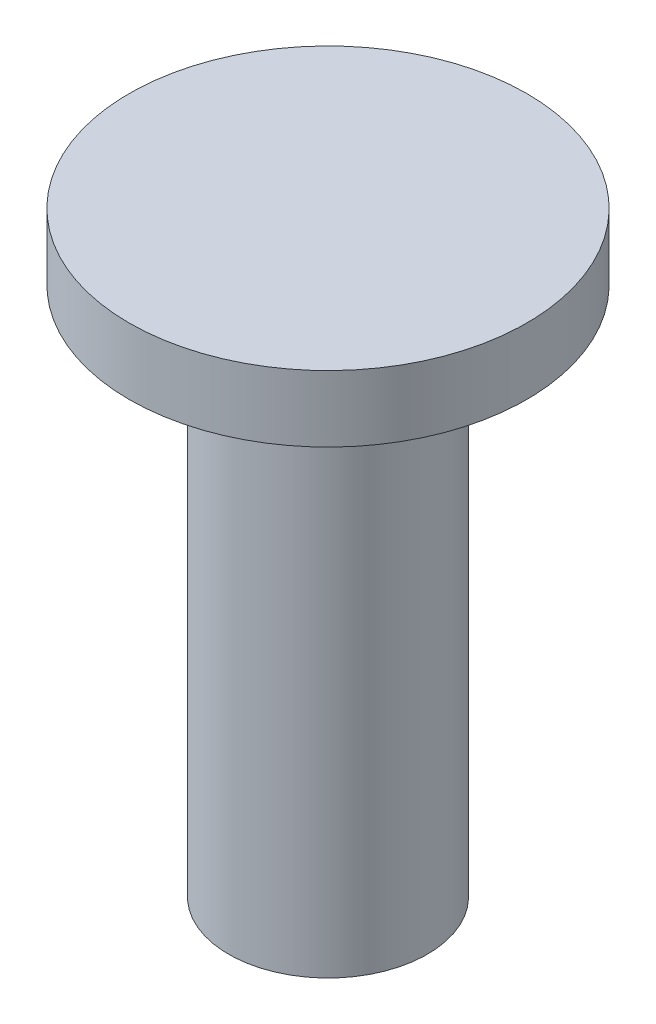
ISO-10303-21;
HEADER;
FILE_DESCRIPTION(('STEP AP214'),'2;1');
FILE_NAME('part.step','',(''),(''),'','','');
FILE_SCHEMA(('AUTOMOTIVE_DESIGN { 1 0 10303 214 1 1 1 1 }'));
ENDSEC;
DATA;
#1=APPLICATION_CONTEXT('core data for automotive mechanical design processes');
#2=APPLICATION_PROTOCOL_DEFINITION('international standard','automotive_design',2000,#1);
#3=PRODUCT_CONTEXT('',#1,'mechanical');
#4=PRODUCT('Part','Part','',(#3));
#5=PRODUCT_RELATED_PRODUCT_CATEGORY('part','',(#4));
#6=PRODUCT_DEFINITION_FORMATION('','',#4);
#7=PRODUCT_DEFINITION_CONTEXT('part definition',#1,'design');
#8=PRODUCT_DEFINITION('design','',#6,#7);
#9=PRODUCT_DEFINITION_SHAPE('','',#8);
#10=(LENGTH_UNIT() NAMED_UNIT(*) SI_UNIT(.MILLI.,.METRE.));
#11=(NAMED_UNIT(*) PLANE_ANGLE_UNIT() SI_UNIT($,.RADIAN.));
#12=(NAMED_UNIT(*) SI_UNIT($,.STERADIAN.) SOLID_ANGLE_UNIT());
#13=UNCERTAINTY_MEASURE_WITH_UNIT(LENGTH_MEASURE(1.E-05),#10,'distance_accuracy_value','');
#14=(GEOMETRIC_REPRESENTATION_CONTEXT(3) GLOBAL_UNCERTAINTY_ASSIGNED_CONTEXT((#13)) GLOBAL_UNIT_ASSIGNED_CONTEXT((#10,
#11,#12)) REPRESENTATION_CONTEXT('',''));
#15=CARTESIAN_POINT('',(0.,0.,0.));
#16=DIRECTION('',(0.,0.,1.));
#17=DIRECTION('',(1.,0.,0.));
#18=AXIS2_PLACEMENT_3D('',#15,#16,#17);
#19=CARTESIAN_POINT('',(0.,1.,0.));
#20=DIRECTION('',(0.,-1.,0.));
#21=DIRECTION('',(0.,0.,-1.));
#22=AXIS2_PLACEMENT_3D('',#19,#20,#21);
#23=CYLINDRICAL_SURFACE('',#22,3.);
#24=CARTESIAN_POINT('',(0.,1.,0.));
#25=DIRECTION('',(0.,1.,0.));
#26=DIRECTION('',(0.,0.,1.));
#27=AXIS2_PLACEMENT_3D('',#24,#25,#26);
#28=CIRCLE('',#27,3.);
#29=CARTESIAN_POINT('',(0.,1.,3.));
#30=VERTEX_POINT('',#29);
#31=EDGE_CURVE('E50',#30,#30,#28,.T.);
#32=ORIENTED_EDGE('',*,*,#31,.F.);
#33=EDGE_LOOP('',(#32));
#34=FACE_BOUND('',#33,.T.);
#35=CARTESIAN_POINT('',(0.,0.,0.));
#36=DIRECTION('',(0.,1.,0.));
#37=DIRECTION('',(0.,0.,1.));
#38=AXIS2_PLACEMENT_3D('',#35,#36,#37);
#39=CIRCLE('',#38,3.);
#40=CARTESIAN_POINT('',(0.,0.,3.));
#41=VERTEX_POINT('',#40);
#42=EDGE_CURVE('E46',#41,#41,#39,.T.);
#43=ORIENTED_EDGE('',*,*,#42,.T.);
#44=EDGE_LOOP('',(#43));
#45=FACE_BOUND('',#44,.T.);
#46=ADVANCED_FACE('F43',(#34,#45),#23,.T.);
#47=CARTESIAN_POINT('',(0.,1.,0.));
#48=DIRECTION('',(0.,1.,0.));
#49=DIRECTION('',(0.,0.,1.));
#50=AXIS2_PLACEMENT_3D('',#47,#48,#49);
#51=PLANE('',#50);
#52=ORIENTED_EDGE('',*,*,#31,.T.);
#53=EDGE_LOOP('',(#52));
#54=FACE_BOUND('',#53,.T.);
#55=ADVANCED_FACE('F67',(#54),#51,.T.);
#56=CARTESIAN_POINT('',(0.,0.,0.));
#57=DIRECTION('',(0.,1.,0.));
#58=DIRECTION('',(0.,0.,1.));
#59=AXIS2_PLACEMENT_3D('',#56,#57,#58);
#60=PLANE('',#59);
#61=CARTESIAN_POINT('',(0.,0.,0.));
#62=DIRECTION('',(0.,-1.,0.));
#63=DIRECTION('',(0.,0.,-1.));
#64=AXIS2_PLACEMENT_3D('',#61,#62,#63);
#65=CIRCLE('',#64,1.5);
#66=CARTESIAN_POINT('',(0.,0.,-1.5));
#67=VERTEX_POINT('',#66);
#68=EDGE_CURVE('E10',#67,#67,#65,.T.);
#69=ORIENTED_EDGE('',*,*,#68,.F.);
#70=EDGE_LOOP('',(#69));
#71=FACE_BOUND('',#70,.T.);
#72=ORIENTED_EDGE('',*,*,#42,.F.);
#73=EDGE_LOOP('',(#72));
#74=FACE_BOUND('',#73,.T.);
#75=ADVANCED_FACE('F64',(#71,#74),#60,.F.);
#76=CARTESIAN_POINT('',(0.,-8.,0.));
#77=DIRECTION('',(0.,1.,0.));
#78=DIRECTION('',(0.,0.,1.));
#79=AXIS2_PLACEMENT_3D('',#76,#77,#78);
#80=CYLINDRICAL_SURFACE('',#79,1.5);
#81=CARTESIAN_POINT('',(0.,-8.,0.));
#82=DIRECTION('',(0.,-1.,0.));
#83=DIRECTION('',(0.,0.,-1.));
#84=AXIS2_PLACEMENT_3D('',#81,#82,#83);
#85=CIRCLE('',#84,1.5);
#86=CARTESIAN_POINT('',(0.,-8.,-1.5));
#87=VERTEX_POINT('',#86);
#88=EDGE_CURVE('E56',#87,#87,#85,.T.);
#89=ORIENTED_EDGE('',*,*,#88,.F.);
#90=EDGE_LOOP('',(#89));
#91=FACE_BOUND('',#90,.T.);
#92=ORIENTED_EDGE('',*,*,#68,.T.);
#93=EDGE_LOOP('',(#92));
#94=FACE_BOUND('',#93,.T.);
#95=ADVANCED_FACE('F66',(#91,#94),#80,.T.);
#96=CARTESIAN_POINT('',(0.,-8.,0.));
#97=DIRECTION('',(0.,-1.,0.));
#98=DIRECTION('',(0.,0.,-1.));
#99=AXIS2_PLACEMENT_3D('',#96,#97,#98);
#100=PLANE('',#99);
#101=ORIENTED_EDGE('',*,*,#88,.T.);
#102=EDGE_LOOP('',(#101));
#103=FACE_BOUND('',#102,.T.);
#104=ADVANCED_FACE('F73',(#103),#100,.T.);
#105=CLOSED_SHELL('',(#46,#55,#75,#95,#104));
#106=MANIFOLD_SOLID_BREP('B2',#105);
#107=ADVANCED_BREP_SHAPE_REPRESENTATION('',(#18,#106),#14);
#108=SHAPE_DEFINITION_REPRESENTATION(#9,#107);
ENDSEC;
END-ISO-10303-21;
